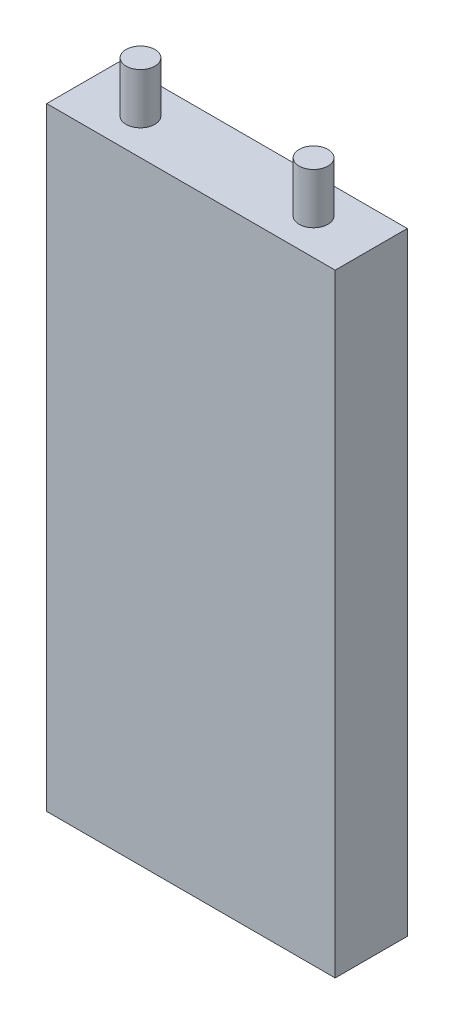
ISO-10303-21;
HEADER;
FILE_DESCRIPTION(('STEP AP214'),'2;1');
FILE_NAME('part.step','',(''),(''),'','','');
FILE_SCHEMA(('AUTOMOTIVE_DESIGN { 1 0 10303 214 1 1 1 1 }'));
ENDSEC;
DATA;
#1=APPLICATION_CONTEXT('core data for automotive mechanical design processes');
#2=APPLICATION_PROTOCOL_DEFINITION('international standard','automotive_design',2000,#1);
#3=PRODUCT_CONTEXT('',#1,'mechanical');
#4=PRODUCT('Part','Part','',(#3));
#5=PRODUCT_RELATED_PRODUCT_CATEGORY('part','',(#4));
#6=PRODUCT_DEFINITION_FORMATION('','',#4);
#7=PRODUCT_DEFINITION_CONTEXT('part definition',#1,'design');
#8=PRODUCT_DEFINITION('design','',#6,#7);
#9=PRODUCT_DEFINITION_SHAPE('','',#8);
#10=(LENGTH_UNIT() NAMED_UNIT(*) SI_UNIT(.MILLI.,.METRE.));
#11=(NAMED_UNIT(*) PLANE_ANGLE_UNIT() SI_UNIT($,.RADIAN.));
#12=(NAMED_UNIT(*) SI_UNIT($,.STERADIAN.) SOLID_ANGLE_UNIT());
#13=UNCERTAINTY_MEASURE_WITH_UNIT(LENGTH_MEASURE(1.E-05),#10,'distance_accuracy_value','');
#14=(GEOMETRIC_REPRESENTATION_CONTEXT(3) GLOBAL_UNCERTAINTY_ASSIGNED_CONTEXT((#13)) GLOBAL_UNIT_ASSIGNED_CONTEXT((#10,
#11,#12)) REPRESENTATION_CONTEXT('',''));
#15=CARTESIAN_POINT('',(0.,0.,0.));
#16=DIRECTION('',(0.,0.,1.));
#17=DIRECTION('',(1.,0.,0.));
#18=AXIS2_PLACEMENT_3D('',#15,#16,#17);
#19=CARTESIAN_POINT('',(76.2,215.9,-25.4));
#20=DIRECTION('',(-1.,0.,0.));
#21=DIRECTION('',(0.,0.,1.));
#22=AXIS2_PLACEMENT_3D('',#19,#20,#21);
#23=PLANE('',#22);
#24=DIRECTION('',(0.,0.,-1.));
#25=VECTOR('',#24,1.);
#26=CARTESIAN_POINT('',(76.2,0.,-25.4));
#27=LINE('',#26,#25);
#28=CARTESIAN_POINT('',(76.2,0.,0.));
#29=VERTEX_POINT('',#28);
#30=CARTESIAN_POINT('',(76.2,0.,-25.4));
#31=VERTEX_POINT('',#30);
#32=EDGE_CURVE('E113',#29,#31,#27,.T.);
#33=ORIENTED_EDGE('',*,*,#32,.T.);
#34=DIRECTION('',(0.,-1.,0.));
#35=VECTOR('',#34,1.);
#36=CARTESIAN_POINT('',(76.2,215.9,-25.4));
#37=LINE('',#36,#35);
#38=CARTESIAN_POINT('',(76.2,215.9,-25.4));
#39=VERTEX_POINT('',#38);
#40=EDGE_CURVE('E11',#39,#31,#37,.T.);
#41=ORIENTED_EDGE('',*,*,#40,.F.);
#42=DIRECTION('',(0.,0.,-1.));
#43=VECTOR('',#42,1.);
#44=CARTESIAN_POINT('',(76.2,215.9,-25.4));
#45=LINE('',#44,#43);
#46=CARTESIAN_POINT('',(76.2,215.9,0.));
#47=VERTEX_POINT('',#46);
#48=EDGE_CURVE('E97',#47,#39,#45,.T.);
#49=ORIENTED_EDGE('',*,*,#48,.F.);
#50=DIRECTION('',(0.,-1.,0.));
#51=VECTOR('',#50,1.);
#52=CARTESIAN_POINT('',(76.2,215.9,0.));
#53=LINE('',#52,#51);
#54=EDGE_CURVE('E109',#47,#29,#53,.T.);
#55=ORIENTED_EDGE('',*,*,#54,.T.);
#56=EDGE_LOOP('',(#33,#41,#49,#55));
#57=FACE_BOUND('',#56,.T.);
#58=ADVANCED_FACE('F45',(#57),#23,.F.);
#59=CARTESIAN_POINT('',(-25.4,215.9,-25.4));
#60=DIRECTION('',(0.,0.,1.));
#61=DIRECTION('',(1.,0.,0.));
#62=AXIS2_PLACEMENT_3D('',#59,#60,#61);
#63=PLANE('',#62);
#64=DIRECTION('',(-1.,0.,0.));
#65=VECTOR('',#64,1.);
#66=CARTESIAN_POINT('',(-25.4,0.,-25.4));
#67=LINE('',#66,#65);
#68=CARTESIAN_POINT('',(-25.4,0.,-25.4));
#69=VERTEX_POINT('',#68);
#70=EDGE_CURVE('E102',#31,#69,#67,.T.);
#71=ORIENTED_EDGE('',*,*,#70,.T.);
#72=DIRECTION('',(0.,-1.,0.));
#73=VECTOR('',#72,1.);
#74=CARTESIAN_POINT('',(-25.4,215.9,-25.4));
#75=LINE('',#74,#73);
#76=CARTESIAN_POINT('',(-25.4,215.9,-25.4));
#77=VERTEX_POINT('',#76);
#78=EDGE_CURVE('E54',#77,#69,#75,.T.);
#79=ORIENTED_EDGE('',*,*,#78,.F.);
#80=DIRECTION('',(-1.,0.,0.));
#81=VECTOR('',#80,1.);
#82=CARTESIAN_POINT('',(-25.4,215.9,-25.4));
#83=LINE('',#82,#81);
#84=EDGE_CURVE('E92',#39,#77,#83,.T.);
#85=ORIENTED_EDGE('',*,*,#84,.F.);
#86=ORIENTED_EDGE('',*,*,#40,.T.);
#87=EDGE_LOOP('',(#71,#79,#85,#86));
#88=FACE_BOUND('',#87,.T.);
#89=ADVANCED_FACE('F101',(#88),#63,.F.);
#90=CARTESIAN_POINT('',(-25.4,215.9,0.));
#91=DIRECTION('',(1.,0.,0.));
#92=DIRECTION('',(0.,0.,-1.));
#93=AXIS2_PLACEMENT_3D('',#90,#91,#92);
#94=PLANE('',#93);
#95=DIRECTION('',(0.,0.,1.));
#96=VECTOR('',#95,1.);
#97=CARTESIAN_POINT('',(-25.4,0.,0.));
#98=LINE('',#97,#96);
#99=CARTESIAN_POINT('',(-25.4,0.,0.));
#100=VERTEX_POINT('',#99);
#101=EDGE_CURVE('E79',#69,#100,#98,.T.);
#102=ORIENTED_EDGE('',*,*,#101,.T.);
#103=DIRECTION('',(0.,-1.,0.));
#104=VECTOR('',#103,1.);
#105=CARTESIAN_POINT('',(-25.4,215.9,0.));
#106=LINE('',#105,#104);
#107=CARTESIAN_POINT('',(-25.4,215.9,0.));
#108=VERTEX_POINT('',#107);
#109=EDGE_CURVE('E104',#108,#100,#106,.T.);
#110=ORIENTED_EDGE('',*,*,#109,.F.);
#111=DIRECTION('',(0.,0.,1.));
#112=VECTOR('',#111,1.);
#113=CARTESIAN_POINT('',(-25.4,215.9,0.));
#114=LINE('',#113,#112);
#115=EDGE_CURVE('E95',#77,#108,#114,.T.);
#116=ORIENTED_EDGE('',*,*,#115,.F.);
#117=ORIENTED_EDGE('',*,*,#78,.T.);
#118=EDGE_LOOP('',(#102,#110,#116,#117));
#119=FACE_BOUND('',#118,.T.);
#120=ADVANCED_FACE('F105',(#119),#94,.F.);
#121=CARTESIAN_POINT('',(-25.4,215.9,0.));
#122=DIRECTION('',(0.,0.,-1.));
#123=DIRECTION('',(-1.,0.,0.));
#124=AXIS2_PLACEMENT_3D('',#121,#122,#123);
#125=PLANE('',#124);
#126=DIRECTION('',(1.,0.,0.));
#127=VECTOR('',#126,1.);
#128=CARTESIAN_POINT('',(-25.4,0.,0.));
#129=LINE('',#128,#127);
#130=EDGE_CURVE('E85',#100,#29,#129,.T.);
#131=ORIENTED_EDGE('',*,*,#130,.T.);
#132=ORIENTED_EDGE('',*,*,#54,.F.);
#133=DIRECTION('',(1.,0.,0.));
#134=VECTOR('',#133,1.);
#135=CARTESIAN_POINT('',(-25.4,215.9,0.));
#136=LINE('',#135,#134);
#137=EDGE_CURVE('E62',#108,#47,#136,.T.);
#138=ORIENTED_EDGE('',*,*,#137,.F.);
#139=ORIENTED_EDGE('',*,*,#109,.T.);
#140=EDGE_LOOP('',(#131,#132,#138,#139));
#141=FACE_BOUND('',#140,.T.);
#142=ADVANCED_FACE('F127',(#141),#125,.F.);
#143=CARTESIAN_POINT('',(0.,215.9,0.));
#144=DIRECTION('',(0.,1.,0.));
#145=DIRECTION('',(0.,0.,1.));
#146=AXIS2_PLACEMENT_3D('',#143,#144,#145);
#147=PLANE('',#146);
#148=CARTESIAN_POINT('',(-5.08,215.9,-12.7));
#149=DIRECTION('',(0.,1.,0.));
#150=DIRECTION('',(0.,0.,1.));
#151=AXIS2_PLACEMENT_3D('',#148,#149,#150);
#152=CIRCLE('',#151,5.08);
#153=CARTESIAN_POINT('',(-5.08,215.9,-7.62));
#154=VERTEX_POINT('',#153);
#155=EDGE_CURVE('E158',#154,#154,#152,.T.);
#156=ORIENTED_EDGE('',*,*,#155,.F.);
#157=EDGE_LOOP('',(#156));
#158=FACE_BOUND('',#157,.T.);
#159=CARTESIAN_POINT('',(55.88,215.9,-12.7));
#160=DIRECTION('',(0.,1.,0.));
#161=DIRECTION('',(0.,0.,1.));
#162=AXIS2_PLACEMENT_3D('',#159,#160,#161);
#163=CIRCLE('',#162,5.08);
#164=CARTESIAN_POINT('',(55.88,215.9,-7.62000000000001));
#165=VERTEX_POINT('',#164);
#166=EDGE_CURVE('E154',#165,#165,#163,.T.);
#167=ORIENTED_EDGE('',*,*,#166,.F.);
#168=EDGE_LOOP('',(#167));
#169=FACE_BOUND('',#168,.T.);
#170=ORIENTED_EDGE('',*,*,#48,.T.);
#171=ORIENTED_EDGE('',*,*,#84,.T.);
#172=ORIENTED_EDGE('',*,*,#115,.T.);
#173=ORIENTED_EDGE('',*,*,#137,.T.);
#174=EDGE_LOOP('',(#170,#171,#172,#173));
#175=FACE_BOUND('',#174,.T.);
#176=ADVANCED_FACE('F93',(#158,#169,#175),#147,.T.);
#177=CARTESIAN_POINT('',(0.,0.,0.));
#178=DIRECTION('',(0.,1.,0.));
#179=DIRECTION('',(0.,0.,1.));
#180=AXIS2_PLACEMENT_3D('',#177,#178,#179);
#181=PLANE('',#180);
#182=CARTESIAN_POINT('',(55.88,0.,-12.7));
#183=DIRECTION('',(0.,-1.,0.));
#184=DIRECTION('',(0.,0.,-1.));
#185=AXIS2_PLACEMENT_3D('',#182,#183,#184);
#186=CIRCLE('',#185,5.20700000000001);
#187=CARTESIAN_POINT('',(55.88,0.,-17.907));
#188=VERTEX_POINT('',#187);
#189=EDGE_CURVE('E143',#188,#188,#186,.T.);
#190=ORIENTED_EDGE('',*,*,#189,.F.);
#191=EDGE_LOOP('',(#190));
#192=FACE_BOUND('',#191,.T.);
#193=CARTESIAN_POINT('',(-5.08,0.,-12.7));
#194=DIRECTION('',(0.,-1.,0.));
#195=DIRECTION('',(0.,0.,-1.));
#196=AXIS2_PLACEMENT_3D('',#193,#194,#195);
#197=CIRCLE('',#196,5.207);
#198=CARTESIAN_POINT('',(-5.08,0.,-17.907));
#199=VERTEX_POINT('',#198);
#200=EDGE_CURVE('E138',#199,#199,#197,.T.);
#201=ORIENTED_EDGE('',*,*,#200,.F.);
#202=EDGE_LOOP('',(#201));
#203=FACE_BOUND('',#202,.T.);
#204=ORIENTED_EDGE('',*,*,#32,.F.);
#205=ORIENTED_EDGE('',*,*,#130,.F.);
#206=ORIENTED_EDGE('',*,*,#101,.F.);
#207=ORIENTED_EDGE('',*,*,#70,.F.);
#208=EDGE_LOOP('',(#204,#205,#206,#207));
#209=FACE_BOUND('',#208,.T.);
#210=ADVANCED_FACE('F130',(#192,#203,#209),#181,.F.);
#211=CARTESIAN_POINT('',(-5.08,17.78,-12.7));
#212=DIRECTION('',(0.,-1.,0.));
#213=DIRECTION('',(0.,0.,-1.));
#214=AXIS2_PLACEMENT_3D('',#211,#212,#213);
#215=CYLINDRICAL_SURFACE('',#214,5.207);
#216=CARTESIAN_POINT('',(-5.08,17.78,-12.7));
#217=DIRECTION('',(0.,-1.,0.));
#218=DIRECTION('',(0.,0.,-1.));
#219=AXIS2_PLACEMENT_3D('',#216,#217,#218);
#220=CIRCLE('',#219,5.207);
#221=CARTESIAN_POINT('',(-5.08,17.78,-17.907));
#222=VERTEX_POINT('',#221);
#223=EDGE_CURVE('E134',#222,#222,#220,.T.);
#224=ORIENTED_EDGE('',*,*,#223,.F.);
#225=EDGE_LOOP('',(#224));
#226=FACE_BOUND('',#225,.T.);
#227=ORIENTED_EDGE('',*,*,#200,.T.);
#228=EDGE_LOOP('',(#227));
#229=FACE_BOUND('',#228,.T.);
#230=ADVANCED_FACE('F207',(#226,#229),#215,.F.);
#231=CARTESIAN_POINT('',(-5.08,17.78,-12.7));
#232=DIRECTION('',(0.,-1.,0.));
#233=DIRECTION('',(0.,0.,-1.));
#234=AXIS2_PLACEMENT_3D('',#231,#232,#233);
#235=PLANE('',#234);
#236=ORIENTED_EDGE('',*,*,#223,.T.);
#237=EDGE_LOOP('',(#236));
#238=FACE_BOUND('',#237,.T.);
#239=ADVANCED_FACE('F210',(#238),#235,.T.);
#240=CARTESIAN_POINT('',(55.88,17.78,-12.7));
#241=DIRECTION('',(0.,-1.,0.));
#242=DIRECTION('',(0.,0.,-1.));
#243=AXIS2_PLACEMENT_3D('',#240,#241,#242);
#244=CYLINDRICAL_SURFACE('',#243,5.20700000000001);
#245=CARTESIAN_POINT('',(55.88,17.78,-12.7));
#246=DIRECTION('',(0.,-1.,0.));
#247=DIRECTION('',(0.,0.,-1.));
#248=AXIS2_PLACEMENT_3D('',#245,#246,#247);
#249=CIRCLE('',#248,5.20700000000001);
#250=CARTESIAN_POINT('',(55.88,17.78,-17.907));
#251=VERTEX_POINT('',#250);
#252=EDGE_CURVE('E117',#251,#251,#249,.T.);
#253=ORIENTED_EDGE('',*,*,#252,.F.);
#254=EDGE_LOOP('',(#253));
#255=FACE_BOUND('',#254,.T.);
#256=ORIENTED_EDGE('',*,*,#189,.T.);
#257=EDGE_LOOP('',(#256));
#258=FACE_BOUND('',#257,.T.);
#259=ADVANCED_FACE('F191',(#255,#258),#244,.F.);
#260=CARTESIAN_POINT('',(55.88,17.78,-12.7));
#261=DIRECTION('',(0.,-1.,0.));
#262=DIRECTION('',(0.,0.,-1.));
#263=AXIS2_PLACEMENT_3D('',#260,#261,#262);
#264=PLANE('',#263);
#265=ORIENTED_EDGE('',*,*,#252,.T.);
#266=EDGE_LOOP('',(#265));
#267=FACE_BOUND('',#266,.T.);
#268=ADVANCED_FACE('F182',(#267),#264,.T.);
#269=CARTESIAN_POINT('',(55.88,233.68,-12.7));
#270=DIRECTION('',(0.,-1.,0.));
#271=DIRECTION('',(0.,0.,-1.));
#272=AXIS2_PLACEMENT_3D('',#269,#270,#271);
#273=CYLINDRICAL_SURFACE('',#272,5.08);
#274=CARTESIAN_POINT('',(55.88,233.68,-12.7));
#275=DIRECTION('',(0.,1.,0.));
#276=DIRECTION('',(0.,0.,1.));
#277=AXIS2_PLACEMENT_3D('',#274,#275,#276);
#278=CIRCLE('',#277,5.08);
#279=CARTESIAN_POINT('',(55.88,233.68,-7.62000000000001));
#280=VERTEX_POINT('',#279);
#281=EDGE_CURVE('E150',#280,#280,#278,.T.);
#282=ORIENTED_EDGE('',*,*,#281,.F.);
#283=EDGE_LOOP('',(#282));
#284=FACE_BOUND('',#283,.T.);
#285=ORIENTED_EDGE('',*,*,#166,.T.);
#286=EDGE_LOOP('',(#285));
#287=FACE_BOUND('',#286,.T.);
#288=ADVANCED_FACE('F180',(#284,#287),#273,.T.);
#289=CARTESIAN_POINT('',(55.88,233.68,-12.7));
#290=DIRECTION('',(0.,1.,0.));
#291=DIRECTION('',(0.,0.,1.));
#292=AXIS2_PLACEMENT_3D('',#289,#290,#291);
#293=PLANE('',#292);
#294=ORIENTED_EDGE('',*,*,#281,.T.);
#295=EDGE_LOOP('',(#294));
#296=FACE_BOUND('',#295,.T.);
#297=ADVANCED_FACE('F171',(#296),#293,.T.);
#298=CARTESIAN_POINT('',(-5.08,233.68,-12.7));
#299=DIRECTION('',(0.,-1.,0.));
#300=DIRECTION('',(0.,0.,-1.));
#301=AXIS2_PLACEMENT_3D('',#298,#299,#300);
#302=CYLINDRICAL_SURFACE('',#301,5.08);
#303=CARTESIAN_POINT('',(-5.08,233.68,-12.7));
#304=DIRECTION('',(0.,1.,0.));
#305=DIRECTION('',(0.,0.,1.));
#306=AXIS2_PLACEMENT_3D('',#303,#304,#305);
#307=CIRCLE('',#306,5.08);
#308=CARTESIAN_POINT('',(-5.08,233.68,-7.62));
#309=VERTEX_POINT('',#308);
#310=EDGE_CURVE('E139',#309,#309,#307,.T.);
#311=ORIENTED_EDGE('',*,*,#310,.F.);
#312=EDGE_LOOP('',(#311));
#313=FACE_BOUND('',#312,.T.);
#314=ORIENTED_EDGE('',*,*,#155,.T.);
#315=EDGE_LOOP('',(#314));
#316=FACE_BOUND('',#315,.T.);
#317=ADVANCED_FACE('F168',(#313,#316),#302,.T.);
#318=CARTESIAN_POINT('',(-5.08,233.68,-12.7));
#319=DIRECTION('',(0.,1.,0.));
#320=DIRECTION('',(0.,0.,1.));
#321=AXIS2_PLACEMENT_3D('',#318,#319,#320);
#322=PLANE('',#321);
#323=ORIENTED_EDGE('',*,*,#310,.T.);
#324=EDGE_LOOP('',(#323));
#325=FACE_BOUND('',#324,.T.);
#326=ADVANCED_FACE('F166',(#325),#322,.T.);
#327=CLOSED_SHELL('',(#58,#89,#120,#142,#176,#210,#230,#239,#259,#268,#288,#297,#317,#326));
#328=MANIFOLD_SOLID_BREP('B2',#327);
#329=ADVANCED_BREP_SHAPE_REPRESENTATION('',(#18,#328),#14);
#330=SHAPE_DEFINITION_REPRESENTATION(#9,#329);
ENDSEC;
END-ISO-10303-21;
